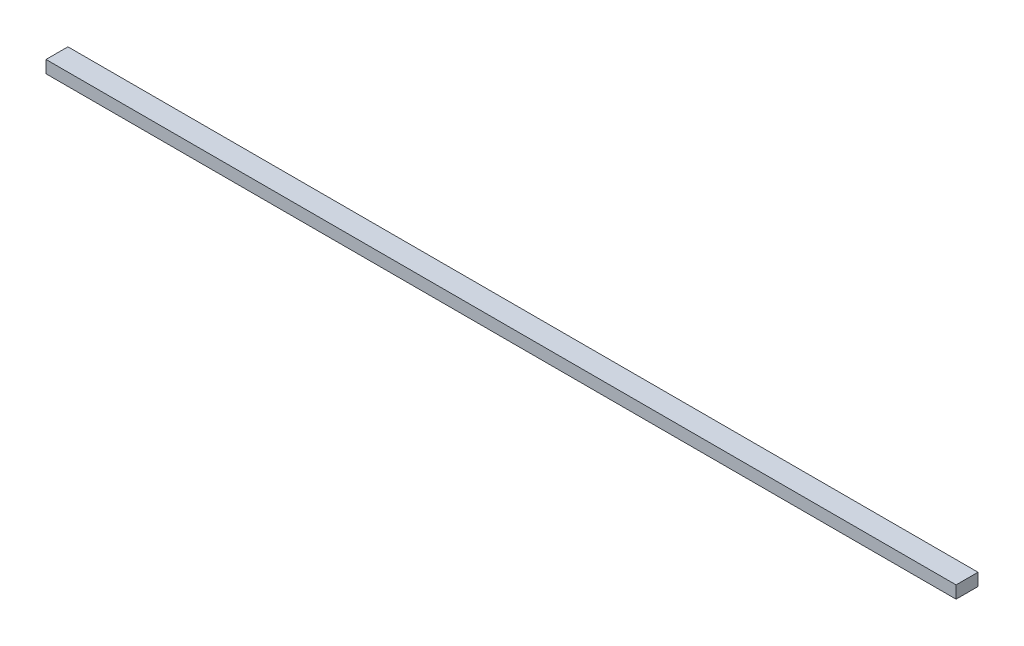
ISO-10303-21;
HEADER;
FILE_DESCRIPTION(('STEP AP214'),'2;1');
FILE_NAME('part.step','',(''),(''),'','','');
FILE_SCHEMA(('AUTOMOTIVE_DESIGN { 1 0 10303 214 1 1 1 1 }'));
ENDSEC;
DATA;
#1=APPLICATION_CONTEXT('core data for automotive mechanical design processes');
#2=APPLICATION_PROTOCOL_DEFINITION('international standard','automotive_design',2000,#1);
#3=PRODUCT_CONTEXT('',#1,'mechanical');
#4=PRODUCT('Part','Part','',(#3));
#5=PRODUCT_RELATED_PRODUCT_CATEGORY('part','',(#4));
#6=PRODUCT_DEFINITION_FORMATION('','',#4);
#7=PRODUCT_DEFINITION_CONTEXT('part definition',#1,'design');
#8=PRODUCT_DEFINITION('design','',#6,#7);
#9=PRODUCT_DEFINITION_SHAPE('','',#8);
#10=(LENGTH_UNIT() NAMED_UNIT(*) SI_UNIT(.MILLI.,.METRE.));
#11=(NAMED_UNIT(*) PLANE_ANGLE_UNIT() SI_UNIT($,.RADIAN.));
#12=(NAMED_UNIT(*) SI_UNIT($,.STERADIAN.) SOLID_ANGLE_UNIT());
#13=UNCERTAINTY_MEASURE_WITH_UNIT(LENGTH_MEASURE(1.E-05),#10,'distance_accuracy_value','');
#14=(GEOMETRIC_REPRESENTATION_CONTEXT(3) GLOBAL_UNCERTAINTY_ASSIGNED_CONTEXT((#13)) GLOBAL_UNIT_ASSIGNED_CONTEXT((#10,
#11,#12)) REPRESENTATION_CONTEXT('',''));
#15=CARTESIAN_POINT('',(0.,0.,0.));
#16=DIRECTION('',(0.,0.,1.));
#17=DIRECTION('',(1.,0.,0.));
#18=AXIS2_PLACEMENT_3D('',#15,#16,#17);
#19=CARTESIAN_POINT('',(110.,3.,-2.65));
#20=DIRECTION('',(-1.,0.,0.));
#21=DIRECTION('',(0.,0.,1.));
#22=AXIS2_PLACEMENT_3D('',#19,#20,#21);
#23=PLANE('',#22);
#24=DIRECTION('',(0.,0.,-1.));
#25=VECTOR('',#24,1.);
#26=CARTESIAN_POINT('',(110.,0.,-2.65));
#27=LINE('',#26,#25);
#28=CARTESIAN_POINT('',(110.,0.,2.65));
#29=VERTEX_POINT('',#28);
#30=CARTESIAN_POINT('',(110.,0.,-2.65));
#31=VERTEX_POINT('',#30);
#32=EDGE_CURVE('E104',#29,#31,#27,.T.);
#33=ORIENTED_EDGE('',*,*,#32,.T.);
#34=DIRECTION('',(0.,-1.,0.));
#35=VECTOR('',#34,1.);
#36=CARTESIAN_POINT('',(110.,3.,-2.65));
#37=LINE('',#36,#35);
#38=CARTESIAN_POINT('',(110.,3.,-2.65));
#39=VERTEX_POINT('',#38);
#40=EDGE_CURVE('E11',#39,#31,#37,.T.);
#41=ORIENTED_EDGE('',*,*,#40,.F.);
#42=DIRECTION('',(0.,0.,-1.));
#43=VECTOR('',#42,1.);
#44=CARTESIAN_POINT('',(110.,3.,-2.65));
#45=LINE('',#44,#43);
#46=CARTESIAN_POINT('',(110.,3.,2.65));
#47=VERTEX_POINT('',#46);
#48=EDGE_CURVE('E92',#47,#39,#45,.T.);
#49=ORIENTED_EDGE('',*,*,#48,.F.);
#50=DIRECTION('',(0.,-1.,0.));
#51=VECTOR('',#50,1.);
#52=CARTESIAN_POINT('',(110.,3.,2.65));
#53=LINE('',#52,#51);
#54=EDGE_CURVE('E100',#47,#29,#53,.T.);
#55=ORIENTED_EDGE('',*,*,#54,.T.);
#56=EDGE_LOOP('',(#33,#41,#49,#55));
#57=FACE_BOUND('',#56,.T.);
#58=ADVANCED_FACE('F41',(#57),#23,.F.);
#59=CARTESIAN_POINT('',(-110.,3.,-2.65));
#60=DIRECTION('',(0.,0.,1.));
#61=DIRECTION('',(1.,0.,0.));
#62=AXIS2_PLACEMENT_3D('',#59,#60,#61);
#63=PLANE('',#62);
#64=DIRECTION('',(-1.,0.,0.));
#65=VECTOR('',#64,1.);
#66=CARTESIAN_POINT('',(-110.,0.,-2.65));
#67=LINE('',#66,#65);
#68=CARTESIAN_POINT('',(-110.,0.,-2.65));
#69=VERTEX_POINT('',#68);
#70=EDGE_CURVE('E96',#31,#69,#67,.T.);
#71=ORIENTED_EDGE('',*,*,#70,.T.);
#72=DIRECTION('',(0.,-1.,0.));
#73=VECTOR('',#72,1.);
#74=CARTESIAN_POINT('',(-110.,3.,-2.65));
#75=LINE('',#74,#73);
#76=CARTESIAN_POINT('',(-110.,3.,-2.65));
#77=VERTEX_POINT('',#76);
#78=EDGE_CURVE('E49',#77,#69,#75,.T.);
#79=ORIENTED_EDGE('',*,*,#78,.F.);
#80=DIRECTION('',(-1.,0.,0.));
#81=VECTOR('',#80,1.);
#82=CARTESIAN_POINT('',(-110.,3.,-2.65));
#83=LINE('',#82,#81);
#84=EDGE_CURVE('E87',#39,#77,#83,.T.);
#85=ORIENTED_EDGE('',*,*,#84,.F.);
#86=ORIENTED_EDGE('',*,*,#40,.T.);
#87=EDGE_LOOP('',(#71,#79,#85,#86));
#88=FACE_BOUND('',#87,.T.);
#89=ADVANCED_FACE('F95',(#88),#63,.F.);
#90=CARTESIAN_POINT('',(-110.,3.,-2.65));
#91=DIRECTION('',(1.,0.,0.));
#92=DIRECTION('',(0.,0.,-1.));
#93=AXIS2_PLACEMENT_3D('',#90,#91,#92);
#94=PLANE('',#93);
#95=DIRECTION('',(0.,0.,1.));
#96=VECTOR('',#95,1.);
#97=CARTESIAN_POINT('',(-110.,0.,-2.65));
#98=LINE('',#97,#96);
#99=CARTESIAN_POINT('',(-110.,0.,2.65));
#100=VERTEX_POINT('',#99);
#101=EDGE_CURVE('E74',#69,#100,#98,.T.);
#102=ORIENTED_EDGE('',*,*,#101,.T.);
#103=DIRECTION('',(0.,-1.,0.));
#104=VECTOR('',#103,1.);
#105=CARTESIAN_POINT('',(-110.,3.,2.65));
#106=LINE('',#105,#104);
#107=CARTESIAN_POINT('',(-110.,3.,2.65));
#108=VERTEX_POINT('',#107);
#109=EDGE_CURVE('E97',#108,#100,#106,.T.);
#110=ORIENTED_EDGE('',*,*,#109,.F.);
#111=DIRECTION('',(0.,0.,1.));
#112=VECTOR('',#111,1.);
#113=CARTESIAN_POINT('',(-110.,3.,-2.65));
#114=LINE('',#113,#112);
#115=EDGE_CURVE('E90',#77,#108,#114,.T.);
#116=ORIENTED_EDGE('',*,*,#115,.F.);
#117=ORIENTED_EDGE('',*,*,#78,.T.);
#118=EDGE_LOOP('',(#102,#110,#116,#117));
#119=FACE_BOUND('',#118,.T.);
#120=ADVANCED_FACE('F98',(#119),#94,.F.);
#121=CARTESIAN_POINT('',(-110.,3.,2.65));
#122=DIRECTION('',(0.,0.,-1.));
#123=DIRECTION('',(-1.,0.,0.));
#124=AXIS2_PLACEMENT_3D('',#121,#122,#123);
#125=PLANE('',#124);
#126=DIRECTION('',(1.,0.,0.));
#127=VECTOR('',#126,1.);
#128=CARTESIAN_POINT('',(-110.,0.,2.65));
#129=LINE('',#128,#127);
#130=EDGE_CURVE('E80',#100,#29,#129,.T.);
#131=ORIENTED_EDGE('',*,*,#130,.T.);
#132=ORIENTED_EDGE('',*,*,#54,.F.);
#133=DIRECTION('',(1.,0.,0.));
#134=VECTOR('',#133,1.);
#135=CARTESIAN_POINT('',(-110.,3.,2.65));
#136=LINE('',#135,#134);
#137=EDGE_CURVE('E57',#108,#47,#136,.T.);
#138=ORIENTED_EDGE('',*,*,#137,.F.);
#139=ORIENTED_EDGE('',*,*,#109,.T.);
#140=EDGE_LOOP('',(#131,#132,#138,#139));
#141=FACE_BOUND('',#140,.T.);
#142=ADVANCED_FACE('F111',(#141),#125,.F.);
#143=CARTESIAN_POINT('',(0.,3.,0.));
#144=DIRECTION('',(0.,1.,0.));
#145=DIRECTION('',(0.,0.,1.));
#146=AXIS2_PLACEMENT_3D('',#143,#144,#145);
#147=PLANE('',#146);
#148=ORIENTED_EDGE('',*,*,#48,.T.);
#149=ORIENTED_EDGE('',*,*,#84,.T.);
#150=ORIENTED_EDGE('',*,*,#115,.T.);
#151=ORIENTED_EDGE('',*,*,#137,.T.);
#152=EDGE_LOOP('',(#148,#149,#150,#151));
#153=FACE_BOUND('',#152,.T.);
#154=ADVANCED_FACE('F88',(#153),#147,.T.);
#155=CARTESIAN_POINT('',(0.,0.,0.));
#156=DIRECTION('',(0.,1.,0.));
#157=DIRECTION('',(0.,0.,1.));
#158=AXIS2_PLACEMENT_3D('',#155,#156,#157);
#159=PLANE('',#158);
#160=ORIENTED_EDGE('',*,*,#32,.F.);
#161=ORIENTED_EDGE('',*,*,#130,.F.);
#162=ORIENTED_EDGE('',*,*,#101,.F.);
#163=ORIENTED_EDGE('',*,*,#70,.F.);
#164=EDGE_LOOP('',(#160,#161,#162,#163));
#165=FACE_BOUND('',#164,.T.);
#166=ADVANCED_FACE('F114',(#165),#159,.F.);
#167=CLOSED_SHELL('',(#58,#89,#120,#142,#154,#166));
#168=MANIFOLD_SOLID_BREP('B2',#167);
#169=ADVANCED_BREP_SHAPE_REPRESENTATION('',(#18,#168),#14);
#170=SHAPE_DEFINITION_REPRESENTATION(#9,#169);
ENDSEC;
END-ISO-10303-21;
